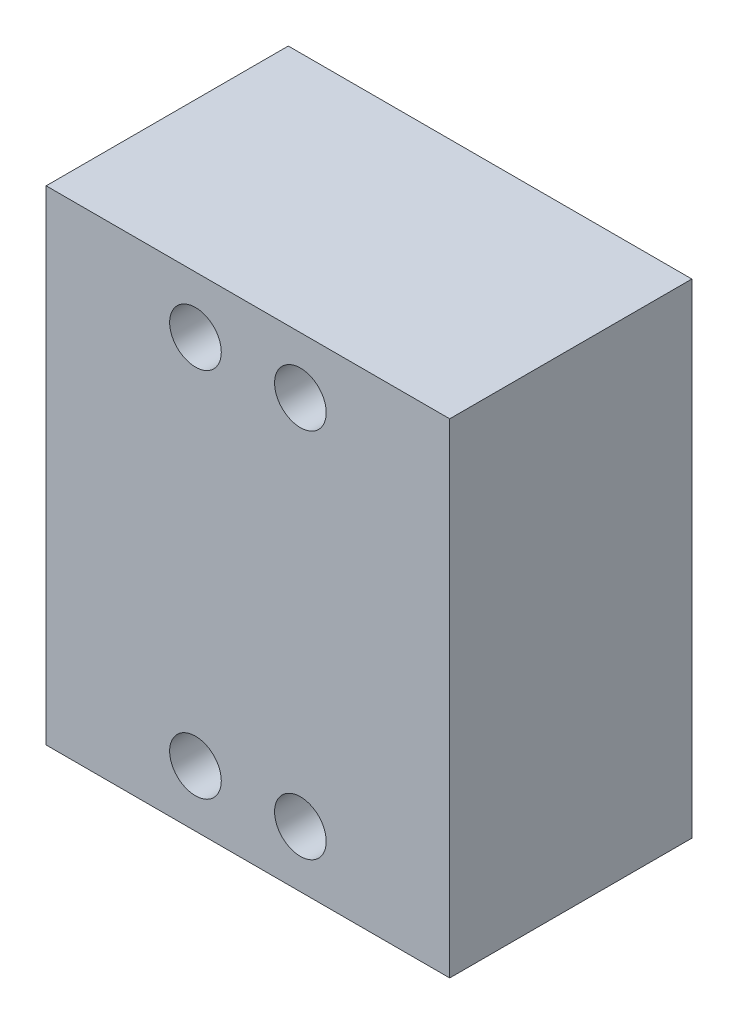
ISO-10303-21;
HEADER;
FILE_DESCRIPTION(('STEP AP214'),'2;1');
FILE_NAME('part.step','',(''),(''),'','','');
FILE_SCHEMA(('AUTOMOTIVE_DESIGN { 1 0 10303 214 1 1 1 1 }'));
ENDSEC;
DATA;
#1=APPLICATION_CONTEXT('core data for automotive mechanical design processes');
#2=APPLICATION_PROTOCOL_DEFINITION('international standard','automotive_design',2000,#1);
#3=PRODUCT_CONTEXT('',#1,'mechanical');
#4=PRODUCT('Part','Part','',(#3));
#5=PRODUCT_RELATED_PRODUCT_CATEGORY('part','',(#4));
#6=PRODUCT_DEFINITION_FORMATION('','',#4);
#7=PRODUCT_DEFINITION_CONTEXT('part definition',#1,'design');
#8=PRODUCT_DEFINITION('design','',#6,#7);
#9=PRODUCT_DEFINITION_SHAPE('','',#8);
#10=(LENGTH_UNIT() NAMED_UNIT(*) SI_UNIT(.MILLI.,.METRE.));
#11=(NAMED_UNIT(*) PLANE_ANGLE_UNIT() SI_UNIT($,.RADIAN.));
#12=(NAMED_UNIT(*) SI_UNIT($,.STERADIAN.) SOLID_ANGLE_UNIT());
#13=UNCERTAINTY_MEASURE_WITH_UNIT(LENGTH_MEASURE(1.E-05),#10,'distance_accuracy_value','');
#14=(GEOMETRIC_REPRESENTATION_CONTEXT(3) GLOBAL_UNCERTAINTY_ASSIGNED_CONTEXT((#13)) GLOBAL_UNIT_ASSIGNED_CONTEXT((#10,
#11,#12)) REPRESENTATION_CONTEXT('',''));
#15=CARTESIAN_POINT('',(0.,0.,0.));
#16=DIRECTION('',(0.,0.,1.));
#17=DIRECTION('',(1.,0.,0.));
#18=AXIS2_PLACEMENT_3D('',#15,#16,#17);
#19=CARTESIAN_POINT('',(-25.,30.,30.));
#20=DIRECTION('',(1.,0.,0.));
#21=DIRECTION('',(0.,1.,0.));
#22=AXIS2_PLACEMENT_3D('',#19,#20,#21);
#23=PLANE('',#22);
#24=DIRECTION('',(0.,-1.,0.));
#25=VECTOR('',#24,1.);
#26=CARTESIAN_POINT('',(-25.,30.,0.));
#27=LINE('',#26,#25);
#28=CARTESIAN_POINT('',(-25.,30.,0.));
#29=VERTEX_POINT('',#28);
#30=CARTESIAN_POINT('',(-25.,-30.,0.));
#31=VERTEX_POINT('',#30);
#32=EDGE_CURVE('E96',#29,#31,#27,.T.);
#33=ORIENTED_EDGE('',*,*,#32,.T.);
#34=DIRECTION('',(0.,0.,-1.));
#35=VECTOR('',#34,1.);
#36=CARTESIAN_POINT('',(-25.,-30.,30.));
#37=LINE('',#36,#35);
#38=CARTESIAN_POINT('',(-25.,-30.,30.));
#39=VERTEX_POINT('',#38);
#40=EDGE_CURVE('E11',#39,#31,#37,.T.);
#41=ORIENTED_EDGE('',*,*,#40,.F.);
#42=DIRECTION('',(0.,-1.,0.));
#43=VECTOR('',#42,1.);
#44=CARTESIAN_POINT('',(-25.,30.,30.));
#45=LINE('',#44,#43);
#46=CARTESIAN_POINT('',(-25.,30.,30.));
#47=VERTEX_POINT('',#46);
#48=EDGE_CURVE('E84',#47,#39,#45,.T.);
#49=ORIENTED_EDGE('',*,*,#48,.F.);
#50=DIRECTION('',(0.,0.,-1.));
#51=VECTOR('',#50,1.);
#52=CARTESIAN_POINT('',(-25.,30.,30.));
#53=LINE('',#52,#51);
#54=EDGE_CURVE('E92',#47,#29,#53,.T.);
#55=ORIENTED_EDGE('',*,*,#54,.T.);
#56=EDGE_LOOP('',(#33,#41,#49,#55));
#57=FACE_BOUND('',#56,.T.);
#58=ADVANCED_FACE('F33',(#57),#23,.F.);
#59=CARTESIAN_POINT('',(-25.,-30.,30.));
#60=DIRECTION('',(0.,1.,0.));
#61=DIRECTION('',(-1.,0.,0.));
#62=AXIS2_PLACEMENT_3D('',#59,#60,#61);
#63=PLANE('',#62);
#64=DIRECTION('',(1.,0.,0.));
#65=VECTOR('',#64,1.);
#66=CARTESIAN_POINT('',(-25.,-30.,0.));
#67=LINE('',#66,#65);
#68=CARTESIAN_POINT('',(25.,-30.,0.));
#69=VERTEX_POINT('',#68);
#70=EDGE_CURVE('E88',#31,#69,#67,.T.);
#71=ORIENTED_EDGE('',*,*,#70,.T.);
#72=DIRECTION('',(0.,0.,-1.));
#73=VECTOR('',#72,1.);
#74=CARTESIAN_POINT('',(25.,-30.,30.));
#75=LINE('',#74,#73);
#76=CARTESIAN_POINT('',(25.,-30.,30.));
#77=VERTEX_POINT('',#76);
#78=EDGE_CURVE('E41',#77,#69,#75,.T.);
#79=ORIENTED_EDGE('',*,*,#78,.F.);
#80=DIRECTION('',(1.,0.,0.));
#81=VECTOR('',#80,1.);
#82=CARTESIAN_POINT('',(-25.,-30.,30.));
#83=LINE('',#82,#81);
#84=EDGE_CURVE('E79',#39,#77,#83,.T.);
#85=ORIENTED_EDGE('',*,*,#84,.F.);
#86=ORIENTED_EDGE('',*,*,#40,.T.);
#87=EDGE_LOOP('',(#71,#79,#85,#86));
#88=FACE_BOUND('',#87,.T.);
#89=ADVANCED_FACE('F87',(#88),#63,.F.);
#90=CARTESIAN_POINT('',(25.,30.,30.));
#91=DIRECTION('',(-1.,0.,0.));
#92=DIRECTION('',(0.,-1.,0.));
#93=AXIS2_PLACEMENT_3D('',#90,#91,#92);
#94=PLANE('',#93);
#95=DIRECTION('',(0.,1.,0.));
#96=VECTOR('',#95,1.);
#97=CARTESIAN_POINT('',(25.,30.,0.));
#98=LINE('',#97,#96);
#99=CARTESIAN_POINT('',(25.,30.,0.));
#100=VERTEX_POINT('',#99);
#101=EDGE_CURVE('E66',#69,#100,#98,.T.);
#102=ORIENTED_EDGE('',*,*,#101,.T.);
#103=DIRECTION('',(0.,0.,-1.));
#104=VECTOR('',#103,1.);
#105=CARTESIAN_POINT('',(25.,30.,30.));
#106=LINE('',#105,#104);
#107=CARTESIAN_POINT('',(25.,30.,30.));
#108=VERTEX_POINT('',#107);
#109=EDGE_CURVE('E89',#108,#100,#106,.T.);
#110=ORIENTED_EDGE('',*,*,#109,.F.);
#111=DIRECTION('',(0.,1.,0.));
#112=VECTOR('',#111,1.);
#113=CARTESIAN_POINT('',(25.,30.,30.));
#114=LINE('',#113,#112);
#115=EDGE_CURVE('E82',#77,#108,#114,.T.);
#116=ORIENTED_EDGE('',*,*,#115,.F.);
#117=ORIENTED_EDGE('',*,*,#78,.T.);
#118=EDGE_LOOP('',(#102,#110,#116,#117));
#119=FACE_BOUND('',#118,.T.);
#120=ADVANCED_FACE('F90',(#119),#94,.F.);
#121=CARTESIAN_POINT('',(-25.,30.,30.));
#122=DIRECTION('',(0.,-1.,0.));
#123=DIRECTION('',(0.,0.,-1.));
#124=AXIS2_PLACEMENT_3D('',#121,#122,#123);
#125=PLANE('',#124);
#126=DIRECTION('',(-1.,0.,0.));
#127=VECTOR('',#126,1.);
#128=CARTESIAN_POINT('',(-25.,30.,0.));
#129=LINE('',#128,#127);
#130=EDGE_CURVE('E72',#100,#29,#129,.T.);
#131=ORIENTED_EDGE('',*,*,#130,.T.);
#132=ORIENTED_EDGE('',*,*,#54,.F.);
#133=DIRECTION('',(-1.,0.,0.));
#134=VECTOR('',#133,1.);
#135=CARTESIAN_POINT('',(-25.,30.,30.));
#136=LINE('',#135,#134);
#137=EDGE_CURVE('E49',#108,#47,#136,.T.);
#138=ORIENTED_EDGE('',*,*,#137,.F.);
#139=ORIENTED_EDGE('',*,*,#109,.T.);
#140=EDGE_LOOP('',(#131,#132,#138,#139));
#141=FACE_BOUND('',#140,.T.);
#142=ADVANCED_FACE('F104',(#141),#125,.F.);
#143=CARTESIAN_POINT('',(0.,0.,30.));
#144=DIRECTION('',(0.,0.,1.));
#145=DIRECTION('',(1.,0.,0.));
#146=AXIS2_PLACEMENT_3D('',#143,#144,#145);
#147=PLANE('',#146);
#148=CARTESIAN_POINT('',(-6.5,23.,30.));
#149=DIRECTION('',(0.,0.,1.));
#150=DIRECTION('',(1.,0.,0.));
#151=AXIS2_PLACEMENT_3D('',#148,#149,#150);
#152=CIRCLE('',#151,3.2);
#153=CARTESIAN_POINT('',(-3.3,23.,30.));
#154=VERTEX_POINT('',#153);
#155=EDGE_CURVE('E130',#154,#154,#152,.T.);
#156=ORIENTED_EDGE('',*,*,#155,.F.);
#157=EDGE_LOOP('',(#156));
#158=FACE_BOUND('',#157,.T.);
#159=CARTESIAN_POINT('',(-6.5,-23.,30.));
#160=DIRECTION('',(0.,0.,1.));
#161=DIRECTION('',(1.,0.,0.));
#162=AXIS2_PLACEMENT_3D('',#159,#160,#161);
#163=CIRCLE('',#162,3.2);
#164=CARTESIAN_POINT('',(-3.3,-23.,30.));
#165=VERTEX_POINT('',#164);
#166=EDGE_CURVE('E124',#165,#165,#163,.T.);
#167=ORIENTED_EDGE('',*,*,#166,.F.);
#168=EDGE_LOOP('',(#167));
#169=FACE_BOUND('',#168,.T.);
#170=CARTESIAN_POINT('',(6.5,-23.,30.));
#171=DIRECTION('',(0.,0.,1.));
#172=DIRECTION('',(1.,0.,0.));
#173=AXIS2_PLACEMENT_3D('',#170,#171,#172);
#174=CIRCLE('',#173,3.2);
#175=CARTESIAN_POINT('',(9.7,-23.,30.));
#176=VERTEX_POINT('',#175);
#177=EDGE_CURVE('E118',#176,#176,#174,.T.);
#178=ORIENTED_EDGE('',*,*,#177,.F.);
#179=EDGE_LOOP('',(#178));
#180=FACE_BOUND('',#179,.T.);
#181=CARTESIAN_POINT('',(6.5,23.,30.));
#182=DIRECTION('',(0.,0.,1.));
#183=DIRECTION('',(1.,0.,0.));
#184=AXIS2_PLACEMENT_3D('',#181,#182,#183);
#185=CIRCLE('',#184,3.2);
#186=CARTESIAN_POINT('',(9.7,23.,30.));
#187=VERTEX_POINT('',#186);
#188=EDGE_CURVE('E112',#187,#187,#185,.T.);
#189=ORIENTED_EDGE('',*,*,#188,.F.);
#190=EDGE_LOOP('',(#189));
#191=FACE_BOUND('',#190,.T.);
#192=ORIENTED_EDGE('',*,*,#48,.T.);
#193=ORIENTED_EDGE('',*,*,#84,.T.);
#194=ORIENTED_EDGE('',*,*,#115,.T.);
#195=ORIENTED_EDGE('',*,*,#137,.T.);
#196=EDGE_LOOP('',(#192,#193,#194,#195));
#197=FACE_BOUND('',#196,.T.);
#198=ADVANCED_FACE('F80',(#158,#169,#180,#191,#197),#147,.T.);
#199=CARTESIAN_POINT('',(0.,0.,0.));
#200=DIRECTION('',(0.,0.,1.));
#201=DIRECTION('',(1.,0.,0.));
#202=AXIS2_PLACEMENT_3D('',#199,#200,#201);
#203=PLANE('',#202);
#204=CARTESIAN_POINT('',(-6.5,23.,0.));
#205=DIRECTION('',(0.,0.,1.));
#206=DIRECTION('',(1.,0.,0.));
#207=AXIS2_PLACEMENT_3D('',#204,#205,#206);
#208=CIRCLE('',#207,3.2);
#209=CARTESIAN_POINT('',(-3.3,23.,0.));
#210=VERTEX_POINT('',#209);
#211=EDGE_CURVE('E127',#210,#210,#208,.T.);
#212=ORIENTED_EDGE('',*,*,#211,.T.);
#213=EDGE_LOOP('',(#212));
#214=FACE_BOUND('',#213,.T.);
#215=CARTESIAN_POINT('',(-6.5,-23.,0.));
#216=DIRECTION('',(0.,0.,1.));
#217=DIRECTION('',(1.,0.,0.));
#218=AXIS2_PLACEMENT_3D('',#215,#216,#217);
#219=CIRCLE('',#218,3.2);
#220=CARTESIAN_POINT('',(-3.3,-23.,0.));
#221=VERTEX_POINT('',#220);
#222=EDGE_CURVE('E121',#221,#221,#219,.T.);
#223=ORIENTED_EDGE('',*,*,#222,.T.);
#224=EDGE_LOOP('',(#223));
#225=FACE_BOUND('',#224,.T.);
#226=CARTESIAN_POINT('',(6.5,-23.,0.));
#227=DIRECTION('',(0.,0.,1.));
#228=DIRECTION('',(1.,0.,0.));
#229=AXIS2_PLACEMENT_3D('',#226,#227,#228);
#230=CIRCLE('',#229,3.2);
#231=CARTESIAN_POINT('',(9.7,-23.,0.));
#232=VERTEX_POINT('',#231);
#233=EDGE_CURVE('E115',#232,#232,#230,.T.);
#234=ORIENTED_EDGE('',*,*,#233,.T.);
#235=EDGE_LOOP('',(#234));
#236=FACE_BOUND('',#235,.T.);
#237=CARTESIAN_POINT('',(6.5,23.,0.));
#238=DIRECTION('',(0.,0.,1.));
#239=DIRECTION('',(1.,0.,0.));
#240=AXIS2_PLACEMENT_3D('',#237,#238,#239);
#241=CIRCLE('',#240,3.2);
#242=CARTESIAN_POINT('',(9.7,23.,0.));
#243=VERTEX_POINT('',#242);
#244=EDGE_CURVE('E99',#243,#243,#241,.T.);
#245=ORIENTED_EDGE('',*,*,#244,.T.);
#246=EDGE_LOOP('',(#245));
#247=FACE_BOUND('',#246,.T.);
#248=ORIENTED_EDGE('',*,*,#32,.F.);
#249=ORIENTED_EDGE('',*,*,#130,.F.);
#250=ORIENTED_EDGE('',*,*,#101,.F.);
#251=ORIENTED_EDGE('',*,*,#70,.F.);
#252=EDGE_LOOP('',(#248,#249,#250,#251));
#253=FACE_BOUND('',#252,.T.);
#254=ADVANCED_FACE('F107',(#214,#225,#236,#247,#253),#203,.F.);
#255=CARTESIAN_POINT('',(6.5,23.,30.));
#256=DIRECTION('',(0.,0.,1.));
#257=DIRECTION('',(1.,0.,0.));
#258=AXIS2_PLACEMENT_3D('',#255,#256,#257);
#259=CYLINDRICAL_SURFACE('',#258,3.2);
#260=ORIENTED_EDGE('',*,*,#244,.F.);
#261=EDGE_LOOP('',(#260));
#262=FACE_BOUND('',#261,.T.);
#263=ORIENTED_EDGE('',*,*,#188,.T.);
#264=EDGE_LOOP('',(#263));
#265=FACE_BOUND('',#264,.T.);
#266=ADVANCED_FACE('F145',(#262,#265),#259,.F.);
#267=CARTESIAN_POINT('',(6.5,-23.,30.));
#268=DIRECTION('',(0.,0.,1.));
#269=DIRECTION('',(1.,0.,0.));
#270=AXIS2_PLACEMENT_3D('',#267,#268,#269);
#271=CYLINDRICAL_SURFACE('',#270,3.2);
#272=ORIENTED_EDGE('',*,*,#233,.F.);
#273=EDGE_LOOP('',(#272));
#274=FACE_BOUND('',#273,.T.);
#275=ORIENTED_EDGE('',*,*,#177,.T.);
#276=EDGE_LOOP('',(#275));
#277=FACE_BOUND('',#276,.T.);
#278=ADVANCED_FACE('F147',(#274,#277),#271,.F.);
#279=CARTESIAN_POINT('',(-6.5,-23.,30.));
#280=DIRECTION('',(0.,0.,1.));
#281=DIRECTION('',(1.,0.,0.));
#282=AXIS2_PLACEMENT_3D('',#279,#280,#281);
#283=CYLINDRICAL_SURFACE('',#282,3.2);
#284=ORIENTED_EDGE('',*,*,#222,.F.);
#285=EDGE_LOOP('',(#284));
#286=FACE_BOUND('',#285,.T.);
#287=ORIENTED_EDGE('',*,*,#166,.T.);
#288=EDGE_LOOP('',(#287));
#289=FACE_BOUND('',#288,.T.);
#290=ADVANCED_FACE('F154',(#286,#289),#283,.F.);
#291=CARTESIAN_POINT('',(-6.5,23.,30.));
#292=DIRECTION('',(0.,0.,1.));
#293=DIRECTION('',(1.,0.,0.));
#294=AXIS2_PLACEMENT_3D('',#291,#292,#293);
#295=CYLINDRICAL_SURFACE('',#294,3.2);
#296=ORIENTED_EDGE('',*,*,#211,.F.);
#297=EDGE_LOOP('',(#296));
#298=FACE_BOUND('',#297,.T.);
#299=ORIENTED_EDGE('',*,*,#155,.T.);
#300=EDGE_LOOP('',(#299));
#301=FACE_BOUND('',#300,.T.);
#302=ADVANCED_FACE('F134',(#298,#301),#295,.F.);
#303=CLOSED_SHELL('',(#58,#89,#120,#142,#198,#254,#266,#278,#290,#302));
#304=MANIFOLD_SOLID_BREP('B2',#303);
#305=ADVANCED_BREP_SHAPE_REPRESENTATION('',(#18,#304),#14);
#306=SHAPE_DEFINITION_REPRESENTATION(#9,#305);
ENDSEC;
END-ISO-10303-21;
